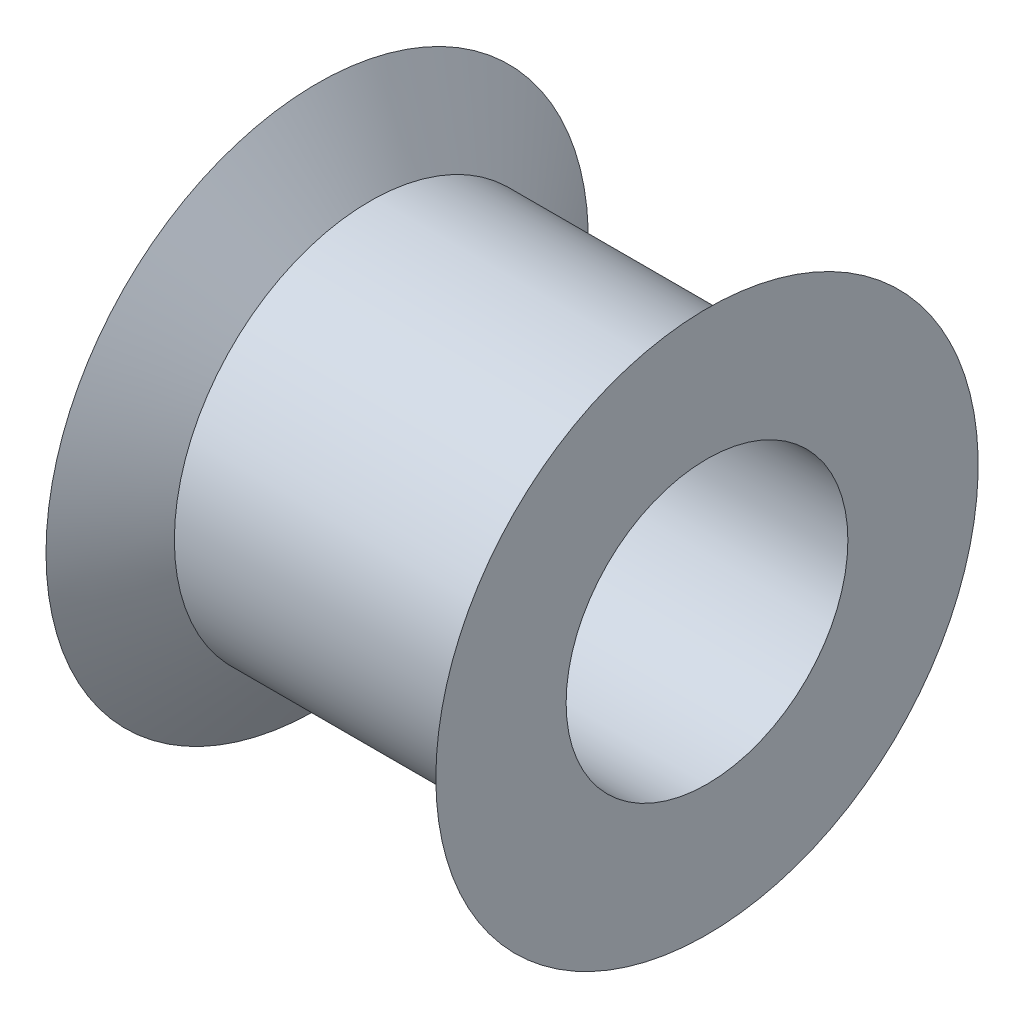
ISO-10303-21;
HEADER;
FILE_DESCRIPTION(('STEP AP214'),'2;1');
FILE_NAME('part.step','',(''),(''),'','','');
FILE_SCHEMA(('AUTOMOTIVE_DESIGN { 1 0 10303 214 1 1 1 1 }'));
ENDSEC;
DATA;
#1=APPLICATION_CONTEXT('core data for automotive mechanical design processes');
#2=APPLICATION_PROTOCOL_DEFINITION('international standard','automotive_design',2000,#1);
#3=PRODUCT_CONTEXT('',#1,'mechanical');
#4=PRODUCT('Part','Part','',(#3));
#5=PRODUCT_RELATED_PRODUCT_CATEGORY('part','',(#4));
#6=PRODUCT_DEFINITION_FORMATION('','',#4);
#7=PRODUCT_DEFINITION_CONTEXT('part definition',#1,'design');
#8=PRODUCT_DEFINITION('design','',#6,#7);
#9=PRODUCT_DEFINITION_SHAPE('','',#8);
#10=(LENGTH_UNIT() NAMED_UNIT(*) SI_UNIT(.MILLI.,.METRE.));
#11=(NAMED_UNIT(*) PLANE_ANGLE_UNIT() SI_UNIT($,.RADIAN.));
#12=(NAMED_UNIT(*) SI_UNIT($,.STERADIAN.) SOLID_ANGLE_UNIT());
#13=UNCERTAINTY_MEASURE_WITH_UNIT(LENGTH_MEASURE(1.E-05),#10,'distance_accuracy_value','');
#14=(GEOMETRIC_REPRESENTATION_CONTEXT(3) GLOBAL_UNCERTAINTY_ASSIGNED_CONTEXT((#13)) GLOBAL_UNIT_ASSIGNED_CONTEXT((#10,
#11,#12)) REPRESENTATION_CONTEXT('',''));
#15=CARTESIAN_POINT('',(0.,0.,0.));
#16=DIRECTION('',(0.,0.,1.));
#17=DIRECTION('',(1.,0.,0.));
#18=AXIS2_PLACEMENT_3D('',#15,#16,#17);
#19=CARTESIAN_POINT('',(0.,2.286,0.));
#20=DIRECTION('',(1.,0.,0.));
#21=DIRECTION('',(0.,0.,-1.));
#22=AXIS2_PLACEMENT_3D('',#19,#20,#21);
#23=PLANE('',#22);
#24=CARTESIAN_POINT('',(0.,0.,0.));
#25=DIRECTION('',(-1.,0.,0.));
#26=DIRECTION('',(0.,0.,1.));
#27=AXIS2_PLACEMENT_3D('',#24,#25,#26);
#28=CIRCLE('',#27,2.286);
#29=CARTESIAN_POINT('',(0.,0.,2.286));
#30=VERTEX_POINT('',#29);
#31=EDGE_CURVE('E66',#30,#30,#28,.T.);
#32=ORIENTED_EDGE('',*,*,#31,.F.);
#33=EDGE_LOOP('',(#32));
#34=FACE_BOUND('',#33,.T.);
#35=CARTESIAN_POINT('',(0.,0.,0.));
#36=DIRECTION('',(-1.,0.,0.));
#37=DIRECTION('',(0.,0.,1.));
#38=AXIS2_PLACEMENT_3D('',#35,#36,#37);
#39=CIRCLE('',#38,4.4);
#40=CARTESIAN_POINT('',(0.,0.,4.4));
#41=VERTEX_POINT('',#40);
#42=EDGE_CURVE('E10',#41,#41,#39,.T.);
#43=ORIENTED_EDGE('',*,*,#42,.T.);
#44=EDGE_LOOP('',(#43));
#45=FACE_BOUND('',#44,.T.);
#46=ADVANCED_FACE('F41',(#34,#45),#23,.F.);
#47=CARTESIAN_POINT('',(0.857754234306897,0.,0.));
#48=DIRECTION('',(-1.,0.,0.));
#49=DIRECTION('',(0.,0.,1.));
#50=AXIS2_PLACEMENT_3D('',#47,#48,#49);
#51=CONICAL_SURFACE('',#50,3.175,0.95993108859688);
#52=ORIENTED_EDGE('',*,*,#42,.F.);
#53=EDGE_LOOP('',(#52));
#54=FACE_BOUND('',#53,.T.);
#55=CARTESIAN_POINT('',(0.857754234306897,0.,0.));
#56=DIRECTION('',(-1.,0.,0.));
#57=DIRECTION('',(0.,0.,1.));
#58=AXIS2_PLACEMENT_3D('',#55,#56,#57);
#59=CIRCLE('',#58,3.175);
#60=CARTESIAN_POINT('',(0.857754234306897,0.,3.175));
#61=VERTEX_POINT('',#60);
#62=EDGE_CURVE('E47',#61,#61,#59,.T.);
#63=ORIENTED_EDGE('',*,*,#62,.T.);
#64=EDGE_LOOP('',(#63));
#65=FACE_BOUND('',#64,.T.);
#66=ADVANCED_FACE('F73',(#54,#65),#51,.T.);
#67=CARTESIAN_POINT('',(0.,0.,0.));
#68=DIRECTION('',(-1.,0.,0.));
#69=DIRECTION('',(0.,0.,1.));
#70=AXIS2_PLACEMENT_3D('',#67,#68,#69);
#71=CYLINDRICAL_SURFACE('',#70,3.175);
#72=ORIENTED_EDGE('',*,*,#62,.F.);
#73=EDGE_LOOP('',(#72));
#74=FACE_BOUND('',#73,.T.);
#75=CARTESIAN_POINT('',(5.4678457656931,0.,0.));
#76=DIRECTION('',(-1.,0.,0.));
#77=DIRECTION('',(0.,0.,1.));
#78=AXIS2_PLACEMENT_3D('',#75,#76,#77);
#79=CIRCLE('',#78,3.175);
#80=CARTESIAN_POINT('',(5.4678457656931,0.,3.175));
#81=VERTEX_POINT('',#80);
#82=EDGE_CURVE('E51',#81,#81,#79,.T.);
#83=ORIENTED_EDGE('',*,*,#82,.T.);
#84=EDGE_LOOP('',(#83));
#85=FACE_BOUND('',#84,.T.);
#86=ADVANCED_FACE('F77',(#74,#85),#71,.T.);
#87=CARTESIAN_POINT('',(6.3256,0.,0.));
#88=DIRECTION('',(1.,0.,0.));
#89=DIRECTION('',(0.,0.,-1.));
#90=AXIS2_PLACEMENT_3D('',#87,#88,#89);
#91=CONICAL_SURFACE('',#90,4.4,0.959931088596878);
#92=ORIENTED_EDGE('',*,*,#82,.F.);
#93=EDGE_LOOP('',(#92));
#94=FACE_BOUND('',#93,.T.);
#95=CARTESIAN_POINT('',(6.3256,0.,0.));
#96=DIRECTION('',(-1.,0.,0.));
#97=DIRECTION('',(0.,0.,1.));
#98=AXIS2_PLACEMENT_3D('',#95,#96,#97);
#99=CIRCLE('',#98,4.4);
#100=CARTESIAN_POINT('',(6.3256,0.,4.4));
#101=VERTEX_POINT('',#100);
#102=EDGE_CURVE('E56',#101,#101,#99,.T.);
#103=ORIENTED_EDGE('',*,*,#102,.T.);
#104=EDGE_LOOP('',(#103));
#105=FACE_BOUND('',#104,.T.);
#106=ADVANCED_FACE('F82',(#94,#105),#91,.T.);
#107=CARTESIAN_POINT('',(6.3256,2.286,0.));
#108=DIRECTION('',(-1.,0.,0.));
#109=DIRECTION('',(0.,0.,1.));
#110=AXIS2_PLACEMENT_3D('',#107,#108,#109);
#111=PLANE('',#110);
#112=ORIENTED_EDGE('',*,*,#102,.F.);
#113=EDGE_LOOP('',(#112));
#114=FACE_BOUND('',#113,.T.);
#115=CARTESIAN_POINT('',(6.3256,0.,0.));
#116=DIRECTION('',(-1.,0.,0.));
#117=DIRECTION('',(0.,0.,1.));
#118=AXIS2_PLACEMENT_3D('',#115,#116,#117);
#119=CIRCLE('',#118,2.286);
#120=CARTESIAN_POINT('',(6.3256,0.,2.286));
#121=VERTEX_POINT('',#120);
#122=EDGE_CURVE('E62',#121,#121,#119,.T.);
#123=ORIENTED_EDGE('',*,*,#122,.T.);
#124=EDGE_LOOP('',(#123));
#125=FACE_BOUND('',#124,.T.);
#126=ADVANCED_FACE('F88',(#114,#125),#111,.F.);
#127=CARTESIAN_POINT('',(0.,0.,0.));
#128=DIRECTION('',(-1.,0.,0.));
#129=DIRECTION('',(0.,0.,1.));
#130=AXIS2_PLACEMENT_3D('',#127,#128,#129);
#131=CYLINDRICAL_SURFACE('',#130,2.286);
#132=ORIENTED_EDGE('',*,*,#122,.F.);
#133=EDGE_LOOP('',(#132));
#134=FACE_BOUND('',#133,.T.);
#135=ORIENTED_EDGE('',*,*,#31,.T.);
#136=EDGE_LOOP('',(#135));
#137=FACE_BOUND('',#136,.T.);
#138=ADVANCED_FACE('F70',(#134,#137),#131,.F.);
#139=CLOSED_SHELL('',(#46,#66,#86,#106,#126,#138));
#140=MANIFOLD_SOLID_BREP('B2',#139);
#141=ADVANCED_BREP_SHAPE_REPRESENTATION('',(#18,#140),#14);
#142=SHAPE_DEFINITION_REPRESENTATION(#9,#141);
ENDSEC;
END-ISO-10303-21;
